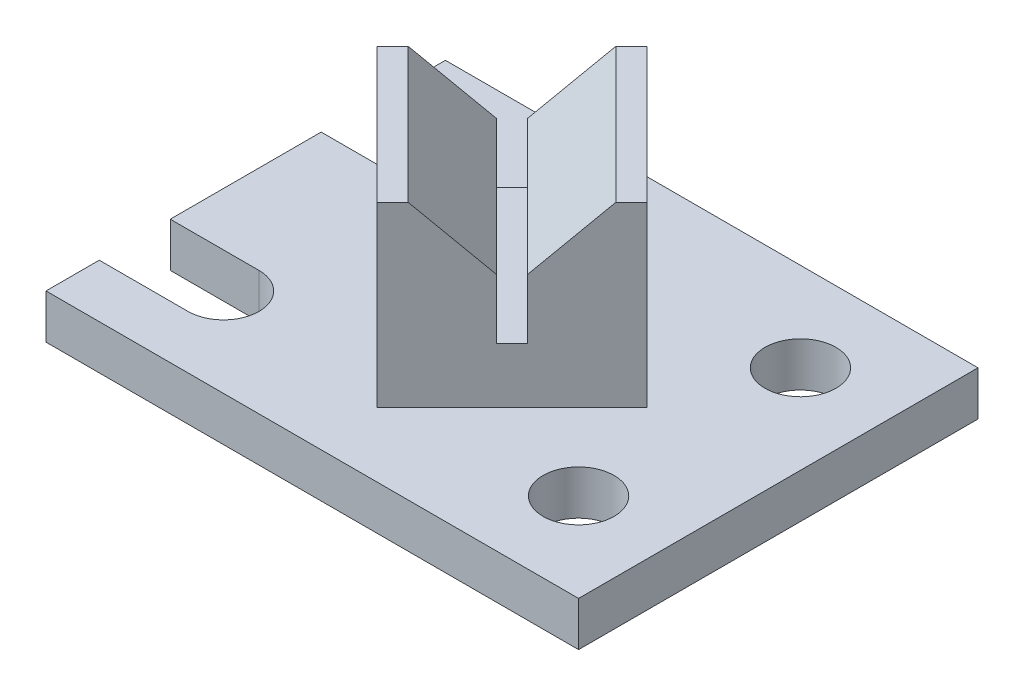
ISO-10303-21;
HEADER;
FILE_DESCRIPTION(('STEP AP214'),'2;1');
FILE_NAME('part.step','',(''),(''),'','','');
FILE_SCHEMA(('AUTOMOTIVE_DESIGN { 1 0 10303 214 1 1 1 1 }'));
ENDSEC;
DATA;
#1=APPLICATION_CONTEXT('core data for automotive mechanical design processes');
#2=APPLICATION_PROTOCOL_DEFINITION('international standard','automotive_design',2000,#1);
#3=PRODUCT_CONTEXT('',#1,'mechanical');
#4=PRODUCT('Part','Part','',(#3));
#5=PRODUCT_RELATED_PRODUCT_CATEGORY('part','',(#4));
#6=PRODUCT_DEFINITION_FORMATION('','',#4);
#7=PRODUCT_DEFINITION_CONTEXT('part definition',#1,'design');
#8=PRODUCT_DEFINITION('design','',#6,#7);
#9=PRODUCT_DEFINITION_SHAPE('','',#8);
#10=(LENGTH_UNIT() NAMED_UNIT(*) SI_UNIT(.MILLI.,.METRE.));
#11=(NAMED_UNIT(*) PLANE_ANGLE_UNIT() SI_UNIT($,.RADIAN.));
#12=(NAMED_UNIT(*) SI_UNIT($,.STERADIAN.) SOLID_ANGLE_UNIT());
#13=UNCERTAINTY_MEASURE_WITH_UNIT(LENGTH_MEASURE(1.E-05),#10,'distance_accuracy_value','');
#14=(GEOMETRIC_REPRESENTATION_CONTEXT(3) GLOBAL_UNCERTAINTY_ASSIGNED_CONTEXT((#13)) GLOBAL_UNIT_ASSIGNED_CONTEXT((#10,
#11,#12)) REPRESENTATION_CONTEXT('',''));
#15=CARTESIAN_POINT('',(0.,0.,0.));
#16=DIRECTION('',(0.,0.,1.));
#17=DIRECTION('',(1.,0.,0.));
#18=AXIS2_PLACEMENT_3D('',#15,#16,#17);
#19=CARTESIAN_POINT('',(0.,63.5,0.));
#20=DIRECTION('',(0.,1.,0.));
#21=DIRECTION('',(0.,0.,1.));
#22=AXIS2_PLACEMENT_3D('',#19,#20,#21);
#23=PLANE('',#22);
#24=DIRECTION('',(0.707106781186549,0.,0.707106781186546));
#25=VECTOR('',#24,1.);
#26=CARTESIAN_POINT('',(-14.8451367515024,63.5,14.8451367515024));
#27=LINE('',#26,#25);
#28=CARTESIAN_POINT('',(-34.1804015635394,63.5,-4.49012806053454));
#29=VERTEX_POINT('',#28);
#30=CARTESIAN_POINT('',(4.49012806053465,63.5,34.1804015635394));
#31=VERTEX_POINT('',#30);
#32=EDGE_CURVE('E364',#29,#31,#27,.T.);
#33=ORIENTED_EDGE('',*,*,#32,.F.);
#34=DIRECTION('',(-0.707106781186546,0.,0.707106781186549));
#35=VECTOR('',#34,1.);
#36=CARTESIAN_POINT('',(0.,63.5,-38.670529624074));
#37=LINE('',#36,#35);
#38=CARTESIAN_POINT('',(-38.670529624074,63.5,0.));
#39=VERTEX_POINT('',#38);
#40=EDGE_CURVE('E239',#29,#39,#37,.T.);
#41=ORIENTED_EDGE('',*,*,#40,.T.);
#42=DIRECTION('',(0.707106781186549,0.,0.707106781186546));
#43=VECTOR('',#42,1.);
#44=CARTESIAN_POINT('',(0.,63.5,38.670529624074));
#45=LINE('',#44,#43);
#46=CARTESIAN_POINT('',(0.,63.5,38.670529624074));
#47=VERTEX_POINT('',#46);
#48=EDGE_CURVE('E229',#39,#47,#45,.T.);
#49=ORIENTED_EDGE('',*,*,#48,.T.);
#50=DIRECTION('',(0.707106781186546,0.,-0.707106781186549));
#51=VECTOR('',#50,1.);
#52=CARTESIAN_POINT('',(38.670529624074,63.5,0.));
#53=LINE('',#52,#51);
#54=EDGE_CURVE('E234',#47,#31,#53,.T.);
#55=ORIENTED_EDGE('',*,*,#54,.T.);
#56=EDGE_LOOP('',(#33,#41,#49,#55));
#57=FACE_BOUND('',#56,.T.);
#58=ADVANCED_FACE('F39',(#57),#23,.T.);
#59=CARTESIAN_POINT('',(0.,12.7,0.));
#60=DIRECTION('',(0.,-1.,0.));
#61=DIRECTION('',(0.,0.,-1.));
#62=AXIS2_PLACEMENT_3D('',#59,#60,#61);
#63=PLANE('',#62);
#64=CARTESIAN_POINT('',(50.8,12.7,-31.75));
#65=DIRECTION('',(0.,-1.,0.));
#66=DIRECTION('',(0.,0.,-1.));
#67=AXIS2_PLACEMENT_3D('',#64,#65,#66);
#68=CIRCLE('',#67,10.16);
#69=CARTESIAN_POINT('',(50.8,12.7,-41.91));
#70=VERTEX_POINT('',#69);
#71=EDGE_CURVE('E267',#70,#70,#68,.T.);
#72=ORIENTED_EDGE('',*,*,#71,.T.);
#73=EDGE_LOOP('',(#72));
#74=FACE_BOUND('',#73,.T.);
#75=DIRECTION('',(1.,0.,0.));
#76=VECTOR('',#75,1.);
#77=CARTESIAN_POINT('',(-76.2,12.7,-41.91));
#78=LINE('',#77,#76);
#79=CARTESIAN_POINT('',(-76.2,12.7,-41.91));
#80=VERTEX_POINT('',#79);
#81=CARTESIAN_POINT('',(-50.8,12.7,-41.91));
#82=VERTEX_POINT('',#81);
#83=EDGE_CURVE('E274',#80,#82,#78,.T.);
#84=ORIENTED_EDGE('',*,*,#83,.T.);
#85=CARTESIAN_POINT('',(-50.8,12.7,-31.75));
#86=DIRECTION('',(0.,-1.,0.));
#87=DIRECTION('',(0.,0.,1.));
#88=AXIS2_PLACEMENT_3D('',#85,#86,#87);
#89=CIRCLE('',#88,10.16);
#90=CARTESIAN_POINT('',(-50.8,12.7,-21.59));
#91=VERTEX_POINT('',#90);
#92=EDGE_CURVE('E282',#82,#91,#89,.T.);
#93=ORIENTED_EDGE('',*,*,#92,.T.);
#94=DIRECTION('',(-1.,0.,0.));
#95=VECTOR('',#94,1.);
#96=CARTESIAN_POINT('',(-76.2,12.7,-21.59));
#97=LINE('',#96,#95);
#98=CARTESIAN_POINT('',(-76.2,12.7,-21.59));
#99=VERTEX_POINT('',#98);
#100=EDGE_CURVE('E262',#91,#99,#97,.T.);
#101=ORIENTED_EDGE('',*,*,#100,.T.);
#102=DIRECTION('',(0.,0.,1.));
#103=VECTOR('',#102,1.);
#104=CARTESIAN_POINT('',(-76.2,12.7,57.15));
#105=LINE('',#104,#103);
#106=CARTESIAN_POINT('',(-76.2,12.7,21.59));
#107=VERTEX_POINT('',#106);
#108=EDGE_CURVE('E338',#99,#107,#105,.T.);
#109=ORIENTED_EDGE('',*,*,#108,.T.);
#110=DIRECTION('',(-1.,0.,0.));
#111=VECTOR('',#110,1.);
#112=CARTESIAN_POINT('',(-76.2,12.7,21.59));
#113=LINE('',#112,#111);
#114=CARTESIAN_POINT('',(-50.8,12.7,21.59));
#115=VERTEX_POINT('',#114);
#116=EDGE_CURVE('E311',#115,#107,#113,.T.);
#117=ORIENTED_EDGE('',*,*,#116,.F.);
#118=CARTESIAN_POINT('',(-50.8,12.7,31.75));
#119=DIRECTION('',(0.,1.,0.));
#120=DIRECTION('',(0.,0.,-1.));
#121=AXIS2_PLACEMENT_3D('',#118,#119,#120);
#122=CIRCLE('',#121,10.16);
#123=CARTESIAN_POINT('',(-50.8,12.7,41.91));
#124=VERTEX_POINT('',#123);
#125=EDGE_CURVE('E314',#124,#115,#122,.T.);
#126=ORIENTED_EDGE('',*,*,#125,.F.);
#127=DIRECTION('',(1.,0.,0.));
#128=VECTOR('',#127,1.);
#129=CARTESIAN_POINT('',(-76.2,12.7,41.91));
#130=LINE('',#129,#128);
#131=CARTESIAN_POINT('',(-76.2,12.7,41.91));
#132=VERTEX_POINT('',#131);
#133=EDGE_CURVE('E301',#132,#124,#130,.T.);
#134=ORIENTED_EDGE('',*,*,#133,.F.);
#135=CARTESIAN_POINT('',(-76.2,12.7,57.15));
#136=VERTEX_POINT('',#135);
#137=EDGE_CURVE('E333',#132,#136,#105,.T.);
#138=ORIENTED_EDGE('',*,*,#137,.T.);
#139=DIRECTION('',(1.,0.,0.));
#140=VECTOR('',#139,1.);
#141=CARTESIAN_POINT('',(-76.2,12.7,57.15));
#142=LINE('',#141,#140);
#143=CARTESIAN_POINT('',(76.2,12.7,57.15));
#144=VERTEX_POINT('',#143);
#145=EDGE_CURVE('E337',#136,#144,#142,.T.);
#146=ORIENTED_EDGE('',*,*,#145,.T.);
#147=DIRECTION('',(0.,0.,-1.));
#148=VECTOR('',#147,1.);
#149=CARTESIAN_POINT('',(76.2,12.7,57.15));
#150=LINE('',#149,#148);
#151=CARTESIAN_POINT('',(76.2,12.7,-57.15));
#152=VERTEX_POINT('',#151);
#153=EDGE_CURVE('E327',#144,#152,#150,.T.);
#154=ORIENTED_EDGE('',*,*,#153,.T.);
#155=DIRECTION('',(-1.,0.,0.));
#156=VECTOR('',#155,1.);
#157=CARTESIAN_POINT('',(-76.2,12.7,-57.15));
#158=LINE('',#157,#156);
#159=CARTESIAN_POINT('',(-76.2,12.7,-57.15));
#160=VERTEX_POINT('',#159);
#161=EDGE_CURVE('E330',#152,#160,#158,.T.);
#162=ORIENTED_EDGE('',*,*,#161,.T.);
#163=EDGE_CURVE('E334',#160,#80,#105,.T.);
#164=ORIENTED_EDGE('',*,*,#163,.T.);
#165=EDGE_LOOP('',(#84,#93,#101,#109,#117,#126,#134,#138,#146,#154,#162,#164));
#166=FACE_BOUND('',#165,.T.);
#167=CARTESIAN_POINT('',(50.8,12.7,31.75));
#168=DIRECTION('',(0.,1.,0.));
#169=DIRECTION('',(0.,0.,1.));
#170=AXIS2_PLACEMENT_3D('',#167,#168,#169);
#171=CIRCLE('',#170,10.16);
#172=CARTESIAN_POINT('',(50.8,12.7,41.91));
#173=VERTEX_POINT('',#172);
#174=EDGE_CURVE('E298',#173,#173,#171,.T.);
#175=ORIENTED_EDGE('',*,*,#174,.F.);
#176=EDGE_LOOP('',(#175));
#177=FACE_BOUND('',#176,.T.);
#178=DIRECTION('',(0.707106781186549,0.,0.707106781186546));
#179=VECTOR('',#178,1.);
#180=CARTESIAN_POINT('',(0.,12.7,38.670529624074));
#181=LINE('',#180,#179);
#182=CARTESIAN_POINT('',(-38.670529624074,12.7,0.));
#183=VERTEX_POINT('',#182);
#184=CARTESIAN_POINT('',(0.,12.7,38.670529624074));
#185=VERTEX_POINT('',#184);
#186=EDGE_CURVE('E228',#183,#185,#181,.T.);
#187=ORIENTED_EDGE('',*,*,#186,.F.);
#188=DIRECTION('',(-0.707106781186546,0.,0.707106781186549));
#189=VECTOR('',#188,1.);
#190=CARTESIAN_POINT('',(0.,12.7,-38.670529624074));
#191=LINE('',#190,#189);
#192=CARTESIAN_POINT('',(0.,12.7,-38.670529624074));
#193=VERTEX_POINT('',#192);
#194=EDGE_CURVE('E233',#193,#183,#191,.T.);
#195=ORIENTED_EDGE('',*,*,#194,.F.);
#196=DIRECTION('',(-0.707106781186549,0.,-0.707106781186546));
#197=VECTOR('',#196,1.);
#198=CARTESIAN_POINT('',(38.670529624074,12.7,0.));
#199=LINE('',#198,#197);
#200=CARTESIAN_POINT('',(38.670529624074,12.7,0.));
#201=VERTEX_POINT('',#200);
#202=EDGE_CURVE('E247',#201,#193,#199,.T.);
#203=ORIENTED_EDGE('',*,*,#202,.F.);
#204=DIRECTION('',(0.707106781186546,0.,-0.707106781186549));
#205=VECTOR('',#204,1.);
#206=CARTESIAN_POINT('',(38.670529624074,12.7,0.));
#207=LINE('',#206,#205);
#208=EDGE_CURVE('E62',#185,#201,#207,.T.);
#209=ORIENTED_EDGE('',*,*,#208,.F.);
#210=EDGE_LOOP('',(#187,#195,#203,#209));
#211=FACE_BOUND('',#210,.T.);
#212=ADVANCED_FACE('F401',(#74,#166,#177,#211),#63,.F.);
#213=CARTESIAN_POINT('',(-76.2,12.7,57.15));
#214=DIRECTION('',(1.,0.,0.));
#215=DIRECTION('',(0.,0.,-1.));
#216=AXIS2_PLACEMENT_3D('',#213,#214,#215);
#217=PLANE('',#216);
#218=DIRECTION('',(0.,1.,0.));
#219=VECTOR('',#218,1.);
#220=CARTESIAN_POINT('',(-76.2,0.,-41.91));
#221=LINE('',#220,#219);
#222=CARTESIAN_POINT('',(-76.2,0.,-41.91));
#223=VERTEX_POINT('',#222);
#224=EDGE_CURVE('E270',#223,#80,#221,.T.);
#225=ORIENTED_EDGE('',*,*,#224,.T.);
#226=ORIENTED_EDGE('',*,*,#163,.F.);
#227=DIRECTION('',(0.,-1.,0.));
#228=VECTOR('',#227,1.);
#229=CARTESIAN_POINT('',(-76.2,12.7,-57.15));
#230=LINE('',#229,#228);
#231=CARTESIAN_POINT('',(-76.2,0.,-57.15));
#232=VERTEX_POINT('',#231);
#233=EDGE_CURVE('E356',#160,#232,#230,.T.);
#234=ORIENTED_EDGE('',*,*,#233,.T.);
#235=DIRECTION('',(0.,0.,1.));
#236=VECTOR('',#235,1.);
#237=CARTESIAN_POINT('',(-76.2,0.,57.15));
#238=LINE('',#237,#236);
#239=EDGE_CURVE('E346',#232,#223,#238,.T.);
#240=ORIENTED_EDGE('',*,*,#239,.T.);
#241=EDGE_LOOP('',(#225,#226,#234,#240));
#242=FACE_BOUND('',#241,.T.);
#243=ADVANCED_FACE('F408',(#242),#217,.F.);
#244=DIRECTION('',(0.,1.,0.));
#245=VECTOR('',#244,1.);
#246=CARTESIAN_POINT('',(-76.2,0.,-21.59));
#247=LINE('',#246,#245);
#248=CARTESIAN_POINT('',(-76.2,0.,-21.59));
#249=VERTEX_POINT('',#248);
#250=EDGE_CURVE('E279',#249,#99,#247,.T.);
#251=ORIENTED_EDGE('',*,*,#250,.F.);
#252=CARTESIAN_POINT('',(-76.2,0.,21.59));
#253=VERTEX_POINT('',#252);
#254=EDGE_CURVE('E349',#249,#253,#238,.T.);
#255=ORIENTED_EDGE('',*,*,#254,.T.);
#256=DIRECTION('',(0.,1.,0.));
#257=VECTOR('',#256,1.);
#258=CARTESIAN_POINT('',(-76.2,0.,21.59));
#259=LINE('',#258,#257);
#260=EDGE_CURVE('E266',#253,#107,#259,.T.);
#261=ORIENTED_EDGE('',*,*,#260,.T.);
#262=ORIENTED_EDGE('',*,*,#108,.F.);
#263=EDGE_LOOP('',(#251,#255,#261,#262));
#264=FACE_BOUND('',#263,.T.);
#265=ADVANCED_FACE('F461',(#264),#217,.F.);
#266=CARTESIAN_POINT('',(0.,0.,0.));
#267=DIRECTION('',(0.,-1.,0.));
#268=DIRECTION('',(0.,0.,-1.));
#269=AXIS2_PLACEMENT_3D('',#266,#267,#268);
#270=PLANE('',#269);
#271=CARTESIAN_POINT('',(-50.8,0.,-31.75));
#272=DIRECTION('',(0.,-1.,0.));
#273=DIRECTION('',(0.,0.,1.));
#274=AXIS2_PLACEMENT_3D('',#271,#272,#273);
#275=CIRCLE('',#274,10.16);
#276=CARTESIAN_POINT('',(-50.8,0.,-41.91));
#277=VERTEX_POINT('',#276);
#278=CARTESIAN_POINT('',(-50.8,0.,-21.59));
#279=VERTEX_POINT('',#278);
#280=EDGE_CURVE('E273',#277,#279,#275,.T.);
#281=ORIENTED_EDGE('',*,*,#280,.F.);
#282=DIRECTION('',(1.,0.,0.));
#283=VECTOR('',#282,1.);
#284=CARTESIAN_POINT('',(-76.2,0.,-41.91));
#285=LINE('',#284,#283);
#286=EDGE_CURVE('E277',#223,#277,#285,.T.);
#287=ORIENTED_EDGE('',*,*,#286,.F.);
#288=ORIENTED_EDGE('',*,*,#239,.F.);
#289=DIRECTION('',(-1.,0.,0.));
#290=VECTOR('',#289,1.);
#291=CARTESIAN_POINT('',(-76.2,0.,-57.15));
#292=LINE('',#291,#290);
#293=CARTESIAN_POINT('',(76.2,0.,-57.15));
#294=VERTEX_POINT('',#293);
#295=EDGE_CURVE('E343',#294,#232,#292,.T.);
#296=ORIENTED_EDGE('',*,*,#295,.F.);
#297=DIRECTION('',(0.,0.,-1.));
#298=VECTOR('',#297,1.);
#299=CARTESIAN_POINT('',(76.2,0.,57.15));
#300=LINE('',#299,#298);
#301=CARTESIAN_POINT('',(76.2,0.,57.15));
#302=VERTEX_POINT('',#301);
#303=EDGE_CURVE('E297',#302,#294,#300,.T.);
#304=ORIENTED_EDGE('',*,*,#303,.F.);
#305=DIRECTION('',(1.,0.,0.));
#306=VECTOR('',#305,1.);
#307=CARTESIAN_POINT('',(-76.2,0.,57.15));
#308=LINE('',#307,#306);
#309=CARTESIAN_POINT('',(-76.2,0.,57.15));
#310=VERTEX_POINT('',#309);
#311=EDGE_CURVE('E331',#310,#302,#308,.T.);
#312=ORIENTED_EDGE('',*,*,#311,.F.);
#313=CARTESIAN_POINT('',(-76.2,0.,41.91));
#314=VERTEX_POINT('',#313);
#315=EDGE_CURVE('E345',#314,#310,#238,.T.);
#316=ORIENTED_EDGE('',*,*,#315,.F.);
#317=DIRECTION('',(1.,0.,0.));
#318=VECTOR('',#317,1.);
#319=CARTESIAN_POINT('',(-76.2,0.,41.91));
#320=LINE('',#319,#318);
#321=CARTESIAN_POINT('',(-50.8,0.,41.91));
#322=VERTEX_POINT('',#321);
#323=EDGE_CURVE('E315',#314,#322,#320,.T.);
#324=ORIENTED_EDGE('',*,*,#323,.T.);
#325=CARTESIAN_POINT('',(-50.8,0.,31.75));
#326=DIRECTION('',(0.,1.,0.));
#327=DIRECTION('',(0.,0.,-1.));
#328=AXIS2_PLACEMENT_3D('',#325,#326,#327);
#329=CIRCLE('',#328,10.16);
#330=CARTESIAN_POINT('',(-50.8,0.,21.59));
#331=VERTEX_POINT('',#330);
#332=EDGE_CURVE('E322',#322,#331,#329,.T.);
#333=ORIENTED_EDGE('',*,*,#332,.T.);
#334=DIRECTION('',(-1.,0.,0.));
#335=VECTOR('',#334,1.);
#336=CARTESIAN_POINT('',(-76.2,0.,21.59));
#337=LINE('',#336,#335);
#338=EDGE_CURVE('E304',#331,#253,#337,.T.);
#339=ORIENTED_EDGE('',*,*,#338,.T.);
#340=ORIENTED_EDGE('',*,*,#254,.F.);
#341=DIRECTION('',(-1.,0.,0.));
#342=VECTOR('',#341,1.);
#343=CARTESIAN_POINT('',(-76.2,0.,-21.59));
#344=LINE('',#343,#342);
#345=EDGE_CURVE('E271',#279,#249,#344,.T.);
#346=ORIENTED_EDGE('',*,*,#345,.F.);
#347=EDGE_LOOP('',(#281,#287,#288,#296,#304,#312,#316,#324,#333,#339,#340,#346));
#348=FACE_BOUND('',#347,.T.);
#349=CARTESIAN_POINT('',(50.8,0.,31.75));
#350=DIRECTION('',(0.,1.,0.));
#351=DIRECTION('',(0.,0.,1.));
#352=AXIS2_PLACEMENT_3D('',#349,#350,#351);
#353=CIRCLE('',#352,10.16);
#354=CARTESIAN_POINT('',(50.8,0.,41.91));
#355=VERTEX_POINT('',#354);
#356=EDGE_CURVE('E294',#355,#355,#353,.T.);
#357=ORIENTED_EDGE('',*,*,#356,.T.);
#358=EDGE_LOOP('',(#357));
#359=FACE_BOUND('',#358,.T.);
#360=CARTESIAN_POINT('',(50.8,0.,-31.75));
#361=DIRECTION('',(0.,-1.,0.));
#362=DIRECTION('',(0.,0.,-1.));
#363=AXIS2_PLACEMENT_3D('',#360,#361,#362);
#364=CIRCLE('',#363,10.16);
#365=CARTESIAN_POINT('',(50.8,0.,-41.91));
#366=VERTEX_POINT('',#365);
#367=EDGE_CURVE('E263',#366,#366,#364,.T.);
#368=ORIENTED_EDGE('',*,*,#367,.F.);
#369=EDGE_LOOP('',(#368));
#370=FACE_BOUND('',#369,.T.);
#371=ADVANCED_FACE('F458',(#348,#359,#370),#270,.T.);
#372=CARTESIAN_POINT('',(76.2,12.7,57.15));
#373=DIRECTION('',(-1.,0.,0.));
#374=DIRECTION('',(0.,0.,1.));
#375=AXIS2_PLACEMENT_3D('',#372,#373,#374);
#376=PLANE('',#375);
#377=ORIENTED_EDGE('',*,*,#303,.T.);
#378=DIRECTION('',(0.,-1.,0.));
#379=VECTOR('',#378,1.);
#380=CARTESIAN_POINT('',(76.2,12.7,-57.15));
#381=LINE('',#380,#379);
#382=EDGE_CURVE('E359',#152,#294,#381,.T.);
#383=ORIENTED_EDGE('',*,*,#382,.F.);
#384=ORIENTED_EDGE('',*,*,#153,.F.);
#385=DIRECTION('',(0.,-1.,0.));
#386=VECTOR('',#385,1.);
#387=CARTESIAN_POINT('',(76.2,12.7,57.15));
#388=LINE('',#387,#386);
#389=EDGE_CURVE('E340',#144,#302,#388,.T.);
#390=ORIENTED_EDGE('',*,*,#389,.T.);
#391=EDGE_LOOP('',(#377,#383,#384,#390));
#392=FACE_BOUND('',#391,.T.);
#393=ADVANCED_FACE('F41',(#392),#376,.F.);
#394=CARTESIAN_POINT('',(-76.2,12.7,-57.15));
#395=DIRECTION('',(0.,0.,1.));
#396=DIRECTION('',(1.,0.,0.));
#397=AXIS2_PLACEMENT_3D('',#394,#395,#396);
#398=PLANE('',#397);
#399=ORIENTED_EDGE('',*,*,#295,.T.);
#400=ORIENTED_EDGE('',*,*,#233,.F.);
#401=ORIENTED_EDGE('',*,*,#161,.F.);
#402=ORIENTED_EDGE('',*,*,#382,.T.);
#403=EDGE_LOOP('',(#399,#400,#401,#402));
#404=FACE_BOUND('',#403,.T.);
#405=ADVANCED_FACE('F468',(#404),#398,.F.);
#406=ORIENTED_EDGE('',*,*,#137,.F.);
#407=DIRECTION('',(0.,1.,0.));
#408=VECTOR('',#407,1.);
#409=CARTESIAN_POINT('',(-76.2,0.,41.91));
#410=LINE('',#409,#408);
#411=EDGE_CURVE('E302',#314,#132,#410,.T.);
#412=ORIENTED_EDGE('',*,*,#411,.F.);
#413=ORIENTED_EDGE('',*,*,#315,.T.);
#414=DIRECTION('',(0.,-1.,0.));
#415=VECTOR('',#414,1.);
#416=CARTESIAN_POINT('',(-76.2,12.7,57.15));
#417=LINE('',#416,#415);
#418=EDGE_CURVE('E353',#136,#310,#417,.T.);
#419=ORIENTED_EDGE('',*,*,#418,.F.);
#420=EDGE_LOOP('',(#406,#412,#413,#419));
#421=FACE_BOUND('',#420,.T.);
#422=ADVANCED_FACE('F465',(#421),#217,.F.);
#423=CARTESIAN_POINT('',(-76.2,12.7,57.15));
#424=DIRECTION('',(0.,0.,-1.));
#425=DIRECTION('',(-1.,0.,0.));
#426=AXIS2_PLACEMENT_3D('',#423,#424,#425);
#427=PLANE('',#426);
#428=ORIENTED_EDGE('',*,*,#311,.T.);
#429=ORIENTED_EDGE('',*,*,#389,.F.);
#430=ORIENTED_EDGE('',*,*,#145,.F.);
#431=ORIENTED_EDGE('',*,*,#418,.T.);
#432=EDGE_LOOP('',(#428,#429,#430,#431));
#433=FACE_BOUND('',#432,.T.);
#434=ADVANCED_FACE('F455',(#433),#427,.F.);
#435=CARTESIAN_POINT('',(-76.2,0.,21.59));
#436=DIRECTION('',(0.,0.,-1.));
#437=DIRECTION('',(-1.,0.,0.));
#438=AXIS2_PLACEMENT_3D('',#435,#436,#437);
#439=PLANE('',#438);
#440=ORIENTED_EDGE('',*,*,#116,.T.);
#441=ORIENTED_EDGE('',*,*,#260,.F.);
#442=ORIENTED_EDGE('',*,*,#338,.F.);
#443=DIRECTION('',(0.,1.,0.));
#444=VECTOR('',#443,1.);
#445=CARTESIAN_POINT('',(-50.8,0.,21.59));
#446=LINE('',#445,#444);
#447=EDGE_CURVE('E307',#331,#115,#446,.T.);
#448=ORIENTED_EDGE('',*,*,#447,.T.);
#449=EDGE_LOOP('',(#440,#441,#442,#448));
#450=FACE_BOUND('',#449,.T.);
#451=ADVANCED_FACE('F452',(#450),#439,.F.);
#452=CARTESIAN_POINT('',(-50.8,0.,31.75));
#453=DIRECTION('',(0.,1.,0.));
#454=DIRECTION('',(0.,0.,1.));
#455=AXIS2_PLACEMENT_3D('',#452,#453,#454);
#456=CYLINDRICAL_SURFACE('',#455,10.16);
#457=ORIENTED_EDGE('',*,*,#125,.T.);
#458=ORIENTED_EDGE('',*,*,#447,.F.);
#459=ORIENTED_EDGE('',*,*,#332,.F.);
#460=DIRECTION('',(0.,1.,0.));
#461=VECTOR('',#460,1.);
#462=CARTESIAN_POINT('',(-50.8,0.,41.91));
#463=LINE('',#462,#461);
#464=EDGE_CURVE('E305',#322,#124,#463,.T.);
#465=ORIENTED_EDGE('',*,*,#464,.T.);
#466=EDGE_LOOP('',(#457,#458,#459,#465));
#467=FACE_BOUND('',#466,.T.);
#468=ADVANCED_FACE('F448',(#467),#456,.F.);
#469=CARTESIAN_POINT('',(-76.2,0.,41.91));
#470=DIRECTION('',(0.,0.,1.));
#471=DIRECTION('',(1.,0.,0.));
#472=AXIS2_PLACEMENT_3D('',#469,#470,#471);
#473=PLANE('',#472);
#474=ORIENTED_EDGE('',*,*,#133,.T.);
#475=ORIENTED_EDGE('',*,*,#464,.F.);
#476=ORIENTED_EDGE('',*,*,#323,.F.);
#477=ORIENTED_EDGE('',*,*,#411,.T.);
#478=EDGE_LOOP('',(#474,#475,#476,#477));
#479=FACE_BOUND('',#478,.T.);
#480=ADVANCED_FACE('F444',(#479),#473,.F.);
#481=CARTESIAN_POINT('',(50.8,0.,31.75));
#482=DIRECTION('',(0.,1.,0.));
#483=DIRECTION('',(0.,0.,1.));
#484=AXIS2_PLACEMENT_3D('',#481,#482,#483);
#485=CYLINDRICAL_SURFACE('',#484,10.16);
#486=ORIENTED_EDGE('',*,*,#356,.F.);
#487=EDGE_LOOP('',(#486));
#488=FACE_BOUND('',#487,.T.);
#489=ORIENTED_EDGE('',*,*,#174,.T.);
#490=EDGE_LOOP('',(#489));
#491=FACE_BOUND('',#490,.T.);
#492=ADVANCED_FACE('F434',(#488,#491),#485,.F.);
#493=CARTESIAN_POINT('',(-76.2,0.,-41.91));
#494=DIRECTION('',(0.,0.,1.));
#495=DIRECTION('',(1.,0.,0.));
#496=AXIS2_PLACEMENT_3D('',#493,#494,#495);
#497=PLANE('',#496);
#498=ORIENTED_EDGE('',*,*,#83,.F.);
#499=ORIENTED_EDGE('',*,*,#224,.F.);
#500=ORIENTED_EDGE('',*,*,#286,.T.);
#501=DIRECTION('',(0.,1.,0.));
#502=VECTOR('',#501,1.);
#503=CARTESIAN_POINT('',(-50.8,0.,-41.91));
#504=LINE('',#503,#502);
#505=EDGE_CURVE('E289',#277,#82,#504,.T.);
#506=ORIENTED_EDGE('',*,*,#505,.T.);
#507=EDGE_LOOP('',(#498,#499,#500,#506));
#508=FACE_BOUND('',#507,.T.);
#509=ADVANCED_FACE('F430',(#508),#497,.T.);
#510=CARTESIAN_POINT('',(-50.8,0.,-31.75));
#511=DIRECTION('',(0.,1.,0.));
#512=DIRECTION('',(0.,0.,1.));
#513=AXIS2_PLACEMENT_3D('',#510,#511,#512);
#514=CYLINDRICAL_SURFACE('',#513,10.16);
#515=ORIENTED_EDGE('',*,*,#92,.F.);
#516=ORIENTED_EDGE('',*,*,#505,.F.);
#517=ORIENTED_EDGE('',*,*,#280,.T.);
#518=DIRECTION('',(0.,1.,0.));
#519=VECTOR('',#518,1.);
#520=CARTESIAN_POINT('',(-50.8,0.,-21.59));
#521=LINE('',#520,#519);
#522=EDGE_CURVE('E291',#279,#91,#521,.T.);
#523=ORIENTED_EDGE('',*,*,#522,.T.);
#524=EDGE_LOOP('',(#515,#516,#517,#523));
#525=FACE_BOUND('',#524,.T.);
#526=ADVANCED_FACE('F433',(#525),#514,.F.);
#527=CARTESIAN_POINT('',(-76.2,0.,-21.59));
#528=DIRECTION('',(0.,0.,-1.));
#529=DIRECTION('',(-1.,0.,0.));
#530=AXIS2_PLACEMENT_3D('',#527,#528,#529);
#531=PLANE('',#530);
#532=ORIENTED_EDGE('',*,*,#100,.F.);
#533=ORIENTED_EDGE('',*,*,#522,.F.);
#534=ORIENTED_EDGE('',*,*,#345,.T.);
#535=ORIENTED_EDGE('',*,*,#250,.T.);
#536=EDGE_LOOP('',(#532,#533,#534,#535));
#537=FACE_BOUND('',#536,.T.);
#538=ADVANCED_FACE('F428',(#537),#531,.T.);
#539=CARTESIAN_POINT('',(50.8,0.,-31.75));
#540=DIRECTION('',(0.,1.,0.));
#541=DIRECTION('',(0.,0.,1.));
#542=AXIS2_PLACEMENT_3D('',#539,#540,#541);
#543=CYLINDRICAL_SURFACE('',#542,10.16);
#544=ORIENTED_EDGE('',*,*,#367,.T.);
#545=EDGE_LOOP('',(#544));
#546=FACE_BOUND('',#545,.T.);
#547=ORIENTED_EDGE('',*,*,#71,.F.);
#548=EDGE_LOOP('',(#547));
#549=FACE_BOUND('',#548,.T.);
#550=ADVANCED_FACE('F425',(#546,#549),#543,.F.);
#551=CARTESIAN_POINT('',(0.,63.5,38.670529624074));
#552=DIRECTION('',(0.707106781186546,0.,-0.707106781186549));
#553=DIRECTION('',(-0.707106781186549,0.,-0.707106781186546));
#554=AXIS2_PLACEMENT_3D('',#551,#552,#553);
#555=PLANE('',#554);
#556=ORIENTED_EDGE('',*,*,#186,.T.);
#557=DIRECTION('',(0.,-1.,0.));
#558=VECTOR('',#557,1.);
#559=CARTESIAN_POINT('',(0.,63.5,38.670529624074));
#560=LINE('',#559,#558);
#561=EDGE_CURVE('E260',#47,#185,#560,.T.);
#562=ORIENTED_EDGE('',*,*,#561,.F.);
#563=ORIENTED_EDGE('',*,*,#48,.F.);
#564=DIRECTION('',(0.,-1.,0.));
#565=VECTOR('',#564,1.);
#566=CARTESIAN_POINT('',(-38.670529624074,63.5,0.));
#567=LINE('',#566,#565);
#568=EDGE_CURVE('E243',#39,#183,#567,.T.);
#569=ORIENTED_EDGE('',*,*,#568,.T.);
#570=EDGE_LOOP('',(#556,#562,#563,#569));
#571=FACE_BOUND('',#570,.T.);
#572=ADVANCED_FACE('F386',(#571),#555,.F.);
#573=CARTESIAN_POINT('',(38.670529624074,63.5,0.));
#574=DIRECTION('',(-0.707106781186549,0.,-0.707106781186546));
#575=DIRECTION('',(-0.707106781186546,0.,0.707106781186549));
#576=AXIS2_PLACEMENT_3D('',#573,#574,#575);
#577=PLANE('',#576);
#578=DIRECTION('',(0.,-1.,0.));
#579=VECTOR('',#578,1.);
#580=CARTESIAN_POINT('',(17.0902007817697,45.6808062707421,21.5803288423042));
#581=LINE('',#580,#579);
#582=CARTESIAN_POINT('',(17.0902007817697,45.6808062707421,21.5803288423042));
#583=VERTEX_POINT('',#582);
#584=CARTESIAN_POINT('',(17.0902007817697,28.575,21.5803288423042));
#585=VERTEX_POINT('',#584);
#586=EDGE_CURVE('E202',#583,#585,#581,.T.);
#587=ORIENTED_EDGE('',*,*,#586,.F.);
#588=DIRECTION('',(0.5,-0.707106781186546,-0.500000000000002));
#589=VECTOR('',#588,1.);
#590=CARTESIAN_POINT('',(4.49012806053465,63.5,34.1804015635394));
#591=LINE('',#590,#589);
#592=EDGE_CURVE('E199',#31,#583,#591,.T.);
#593=ORIENTED_EDGE('',*,*,#592,.F.);
#594=ORIENTED_EDGE('',*,*,#54,.F.);
#595=ORIENTED_EDGE('',*,*,#561,.T.);
#596=ORIENTED_EDGE('',*,*,#208,.T.);
#597=DIRECTION('',(0.,-1.,0.));
#598=VECTOR('',#597,1.);
#599=CARTESIAN_POINT('',(38.670529624074,63.5,0.));
#600=LINE('',#599,#598);
#601=CARTESIAN_POINT('',(38.670529624074,63.5,0.));
#602=VERTEX_POINT('',#601);
#603=EDGE_CURVE('E257',#602,#201,#600,.T.);
#604=ORIENTED_EDGE('',*,*,#603,.F.);
#605=CARTESIAN_POINT('',(34.1804015635394,63.5,4.49012806053453));
#606=VERTEX_POINT('',#605);
#607=EDGE_CURVE('E232',#606,#602,#53,.T.);
#608=ORIENTED_EDGE('',*,*,#607,.F.);
#609=DIRECTION('',(0.5,0.707106781186546,-0.500000000000002));
#610=VECTOR('',#609,1.);
#611=CARTESIAN_POINT('',(34.1804015635394,63.5,4.49012806053452));
#612=LINE('',#611,#610);
#613=CARTESIAN_POINT('',(21.5803288423043,45.6808062707421,17.0902007817697));
#614=VERTEX_POINT('',#613);
#615=EDGE_CURVE('E54',#614,#606,#612,.T.);
#616=ORIENTED_EDGE('',*,*,#615,.F.);
#617=DIRECTION('',(0.,1.,0.));
#618=VECTOR('',#617,1.);
#619=CARTESIAN_POINT('',(21.5803288423043,45.6808062707421,17.0902007817697));
#620=LINE('',#619,#618);
#621=CARTESIAN_POINT('',(21.5803288423043,28.575,17.0902007817697));
#622=VERTEX_POINT('',#621);
#623=EDGE_CURVE('E212',#622,#614,#620,.T.);
#624=ORIENTED_EDGE('',*,*,#623,.F.);
#625=DIRECTION('',(0.707106781186546,0.,-0.707106781186549));
#626=VECTOR('',#625,1.);
#627=CARTESIAN_POINT('',(21.5803288423043,28.575,17.0902007817697));
#628=LINE('',#627,#626);
#629=EDGE_CURVE('E193',#585,#622,#628,.T.);
#630=ORIENTED_EDGE('',*,*,#629,.F.);
#631=EDGE_LOOP('',(#587,#593,#594,#595,#596,#604,#608,#616,#624,#630));
#632=FACE_BOUND('',#631,.T.);
#633=ADVANCED_FACE('F210',(#632),#577,.F.);
#634=CARTESIAN_POINT('',(38.670529624074,63.5,0.));
#635=DIRECTION('',(-0.707106781186546,0.,0.707106781186549));
#636=DIRECTION('',(0.707106781186549,0.,0.707106781186546));
#637=AXIS2_PLACEMENT_3D('',#634,#635,#636);
#638=PLANE('',#637);
#639=ORIENTED_EDGE('',*,*,#202,.T.);
#640=DIRECTION('',(0.,-1.,0.));
#641=VECTOR('',#640,1.);
#642=CARTESIAN_POINT('',(0.,63.5,-38.670529624074));
#643=LINE('',#642,#641);
#644=CARTESIAN_POINT('',(0.,63.5,-38.670529624074));
#645=VERTEX_POINT('',#644);
#646=EDGE_CURVE('E254',#645,#193,#643,.T.);
#647=ORIENTED_EDGE('',*,*,#646,.F.);
#648=DIRECTION('',(-0.707106781186549,0.,-0.707106781186546));
#649=VECTOR('',#648,1.);
#650=CARTESIAN_POINT('',(38.670529624074,63.5,0.));
#651=LINE('',#650,#649);
#652=EDGE_CURVE('E237',#602,#645,#651,.T.);
#653=ORIENTED_EDGE('',*,*,#652,.F.);
#654=ORIENTED_EDGE('',*,*,#603,.T.);
#655=EDGE_LOOP('',(#639,#647,#653,#654));
#656=FACE_BOUND('',#655,.T.);
#657=ADVANCED_FACE('F382',(#656),#638,.F.);
#658=CARTESIAN_POINT('',(0.,63.5,-38.670529624074));
#659=DIRECTION('',(0.707106781186549,0.,0.707106781186546));
#660=DIRECTION('',(0.707106781186546,0.,-0.707106781186549));
#661=AXIS2_PLACEMENT_3D('',#658,#659,#660);
#662=PLANE('',#661);
#663=ORIENTED_EDGE('',*,*,#40,.F.);
#664=DIRECTION('',(0.5,-0.707106781186546,-0.500000000000002));
#665=VECTOR('',#664,1.);
#666=CARTESIAN_POINT('',(-17.0902007817696,39.330806270742,-21.5803288423043));
#667=LINE('',#666,#665);
#668=CARTESIAN_POINT('',(-21.5803288423043,45.6808062707421,-17.0902007817697));
#669=VERTEX_POINT('',#668);
#670=EDGE_CURVE('E225',#29,#669,#667,.T.);
#671=ORIENTED_EDGE('',*,*,#670,.T.);
#672=DIRECTION('',(0.,-1.,0.));
#673=VECTOR('',#672,1.);
#674=CARTESIAN_POINT('',(-21.5803288423043,63.5,-17.0902007817697));
#675=LINE('',#674,#673);
#676=CARTESIAN_POINT('',(-21.5803288423043,28.575,-17.0902007817697));
#677=VERTEX_POINT('',#676);
#678=EDGE_CURVE('E11',#669,#677,#675,.T.);
#679=ORIENTED_EDGE('',*,*,#678,.T.);
#680=DIRECTION('',(0.707106781186546,0.,-0.707106781186549));
#681=VECTOR('',#680,1.);
#682=CARTESIAN_POINT('',(0.,28.575,-38.670529624074));
#683=LINE('',#682,#681);
#684=CARTESIAN_POINT('',(-17.0902007817697,28.575,-21.5803288423043));
#685=VERTEX_POINT('',#684);
#686=EDGE_CURVE('E196',#677,#685,#683,.T.);
#687=ORIENTED_EDGE('',*,*,#686,.T.);
#688=DIRECTION('',(0.,1.,0.));
#689=VECTOR('',#688,1.);
#690=CARTESIAN_POINT('',(-17.0902007817697,63.5,-21.5803288423042));
#691=LINE('',#690,#689);
#692=CARTESIAN_POINT('',(-17.0902007817697,45.6808062707421,-21.5803288423043));
#693=VERTEX_POINT('',#692);
#694=EDGE_CURVE('E47',#685,#693,#691,.T.);
#695=ORIENTED_EDGE('',*,*,#694,.T.);
#696=DIRECTION('',(0.5,0.707106781186546,-0.500000000000002));
#697=VECTOR('',#696,1.);
#698=CARTESIAN_POINT('',(-2.24506403026735,66.675,-36.4254655938067));
#699=LINE('',#698,#697);
#700=CARTESIAN_POINT('',(-4.49012806053466,63.5,-34.1804015635394));
#701=VERTEX_POINT('',#700);
#702=EDGE_CURVE('E219',#693,#701,#699,.T.);
#703=ORIENTED_EDGE('',*,*,#702,.T.);
#704=EDGE_CURVE('E240',#645,#701,#37,.T.);
#705=ORIENTED_EDGE('',*,*,#704,.F.);
#706=ORIENTED_EDGE('',*,*,#646,.T.);
#707=ORIENTED_EDGE('',*,*,#194,.T.);
#708=ORIENTED_EDGE('',*,*,#568,.F.);
#709=EDGE_LOOP('',(#663,#671,#679,#687,#695,#703,#705,#706,#707,#708));
#710=FACE_BOUND('',#709,.T.);
#711=ADVANCED_FACE('F369',(#710),#662,.F.);
#712=DIRECTION('',(-0.707106781186549,0.,-0.707106781186546));
#713=VECTOR('',#712,1.);
#714=CARTESIAN_POINT('',(14.8451367515024,63.5,-14.8451367515024));
#715=LINE('',#714,#713);
#716=EDGE_CURVE('E362',#606,#701,#715,.T.);
#717=ORIENTED_EDGE('',*,*,#716,.F.);
#718=ORIENTED_EDGE('',*,*,#607,.T.);
#719=ORIENTED_EDGE('',*,*,#652,.T.);
#720=ORIENTED_EDGE('',*,*,#704,.T.);
#721=EDGE_LOOP('',(#717,#718,#719,#720));
#722=FACE_BOUND('',#721,.T.);
#723=ADVANCED_FACE('F377',(#722),#23,.T.);
#724=CARTESIAN_POINT('',(-68.9200640302674,45.6808062707421,-64.4299359697326));
#725=DIRECTION('',(-0.707106781186546,0.,0.707106781186549));
#726=DIRECTION('',(0.707106781186549,0.,0.707106781186546));
#727=AXIS2_PLACEMENT_3D('',#724,#725,#726);
#728=PLANE('',#727);
#729=DIRECTION('',(0.707106781186549,0.,0.707106781186546));
#730=VECTOR('',#729,1.);
#731=CARTESIAN_POINT('',(-68.9200640302674,45.6808062707421,-64.4299359697326));
#732=LINE('',#731,#730);
#733=EDGE_CURVE('E205',#669,#583,#732,.T.);
#734=ORIENTED_EDGE('',*,*,#733,.T.);
#735=ORIENTED_EDGE('',*,*,#586,.T.);
#736=DIRECTION('',(0.707106781186549,0.,0.707106781186546));
#737=VECTOR('',#736,1.);
#738=CARTESIAN_POINT('',(-68.9200640302674,28.575,-64.4299359697326));
#739=LINE('',#738,#737);
#740=EDGE_CURVE('E188',#677,#585,#739,.T.);
#741=ORIENTED_EDGE('',*,*,#740,.F.);
#742=ORIENTED_EDGE('',*,*,#678,.F.);
#743=EDGE_LOOP('',(#734,#735,#741,#742));
#744=FACE_BOUND('',#743,.T.);
#745=ADVANCED_FACE('F203',(#744),#728,.F.);
#746=CARTESIAN_POINT('',(-64.4299359697329,45.6808062707421,-68.9200640302672));
#747=DIRECTION('',(0.707106781186546,0.,-0.707106781186549));
#748=DIRECTION('',(-0.707106781186549,0.,-0.707106781186546));
#749=AXIS2_PLACEMENT_3D('',#746,#747,#748);
#750=PLANE('',#749);
#751=DIRECTION('',(0.707106781186549,0.,0.707106781186546));
#752=VECTOR('',#751,1.);
#753=CARTESIAN_POINT('',(-64.4299359697329,28.575,-68.9200640302672));
#754=LINE('',#753,#752);
#755=EDGE_CURVE('E198',#685,#622,#754,.T.);
#756=ORIENTED_EDGE('',*,*,#755,.T.);
#757=ORIENTED_EDGE('',*,*,#623,.T.);
#758=DIRECTION('',(0.707106781186549,0.,0.707106781186546));
#759=VECTOR('',#758,1.);
#760=CARTESIAN_POINT('',(-64.4299359697329,45.6808062707421,-68.9200640302672));
#761=LINE('',#760,#759);
#762=EDGE_CURVE('E220',#693,#614,#761,.T.);
#763=ORIENTED_EDGE('',*,*,#762,.F.);
#764=ORIENTED_EDGE('',*,*,#694,.F.);
#765=EDGE_LOOP('',(#756,#757,#763,#764));
#766=FACE_BOUND('',#765,.T.);
#767=ADVANCED_FACE('F373',(#766),#750,.F.);
#768=CARTESIAN_POINT('',(-64.4299359697329,28.575,-68.9200640302672));
#769=DIRECTION('',(0.,-1.,0.));
#770=DIRECTION('',(0.,0.,-1.));
#771=AXIS2_PLACEMENT_3D('',#768,#769,#770);
#772=PLANE('',#771);
#773=ORIENTED_EDGE('',*,*,#740,.T.);
#774=ORIENTED_EDGE('',*,*,#629,.T.);
#775=ORIENTED_EDGE('',*,*,#755,.F.);
#776=ORIENTED_EDGE('',*,*,#686,.F.);
#777=EDGE_LOOP('',(#773,#774,#775,#776));
#778=FACE_BOUND('',#777,.T.);
#779=ADVANCED_FACE('F190',(#778),#772,.F.);
#780=CARTESIAN_POINT('',(-81.5201367515025,63.5,-51.8298632484975));
#781=DIRECTION('',(-0.499999999999998,-0.707106781186549,0.5));
#782=DIRECTION('',(0.,-0.577350269189625,-0.816496580927727));
#783=AXIS2_PLACEMENT_3D('',#780,#781,#782);
#784=PLANE('',#783);
#785=ORIENTED_EDGE('',*,*,#32,.T.);
#786=ORIENTED_EDGE('',*,*,#592,.T.);
#787=ORIENTED_EDGE('',*,*,#733,.F.);
#788=ORIENTED_EDGE('',*,*,#670,.F.);
#789=EDGE_LOOP('',(#785,#786,#787,#788));
#790=FACE_BOUND('',#789,.T.);
#791=ADVANCED_FACE('F391',(#790),#784,.F.);
#792=CARTESIAN_POINT('',(-51.8298632484978,63.5,-81.5201367515023));
#793=DIRECTION('',(0.499999999999998,-0.707106781186549,-0.5));
#794=DIRECTION('',(0.,0.577350269189625,-0.816496580927727));
#795=AXIS2_PLACEMENT_3D('',#792,#793,#794);
#796=PLANE('',#795);
#797=ORIENTED_EDGE('',*,*,#762,.T.);
#798=ORIENTED_EDGE('',*,*,#615,.T.);
#799=ORIENTED_EDGE('',*,*,#716,.T.);
#800=ORIENTED_EDGE('',*,*,#702,.F.);
#801=EDGE_LOOP('',(#797,#798,#799,#800));
#802=FACE_BOUND('',#801,.T.);
#803=ADVANCED_FACE('F374',(#802),#796,.F.);
#804=CLOSED_SHELL('',(#58,#212,#243,#265,#371,#393,#405,#422,#434,#451,#468,#480,#492,#509,#526,
#538,#550,#572,#633,#657,#711,#723,#745,#767,#779,#791,#803));
#805=MANIFOLD_SOLID_BREP('B2',#804);
#806=ADVANCED_BREP_SHAPE_REPRESENTATION('',(#18,#805),#14);
#807=SHAPE_DEFINITION_REPRESENTATION(#9,#806);
ENDSEC;
END-ISO-10303-21;
